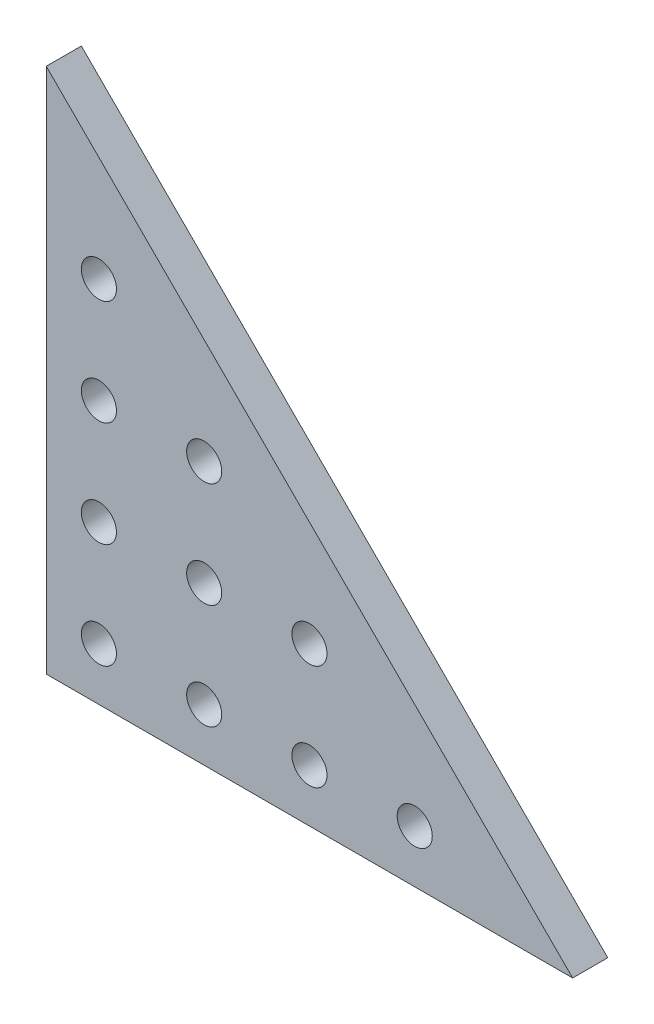
ISO-10303-21;
HEADER;
FILE_DESCRIPTION(('STEP AP214'),'2;1');
FILE_NAME('part.step','',(''),(''),'','','');
FILE_SCHEMA(('AUTOMOTIVE_DESIGN { 1 0 10303 214 1 1 1 1 }'));
ENDSEC;
DATA;
#1=APPLICATION_CONTEXT('core data for automotive mechanical design processes');
#2=APPLICATION_PROTOCOL_DEFINITION('international standard','automotive_design',2000,#1);
#3=PRODUCT_CONTEXT('',#1,'mechanical');
#4=PRODUCT('Part','Part','',(#3));
#5=PRODUCT_RELATED_PRODUCT_CATEGORY('part','',(#4));
#6=PRODUCT_DEFINITION_FORMATION('','',#4);
#7=PRODUCT_DEFINITION_CONTEXT('part definition',#1,'design');
#8=PRODUCT_DEFINITION('design','',#6,#7);
#9=PRODUCT_DEFINITION_SHAPE('','',#8);
#10=(LENGTH_UNIT() NAMED_UNIT(*) SI_UNIT(.MILLI.,.METRE.));
#11=(NAMED_UNIT(*) PLANE_ANGLE_UNIT() SI_UNIT($,.RADIAN.));
#12=(NAMED_UNIT(*) SI_UNIT($,.STERADIAN.) SOLID_ANGLE_UNIT());
#13=UNCERTAINTY_MEASURE_WITH_UNIT(LENGTH_MEASURE(1.E-05),#10,'distance_accuracy_value','');
#14=(GEOMETRIC_REPRESENTATION_CONTEXT(3) GLOBAL_UNCERTAINTY_ASSIGNED_CONTEXT((#13)) GLOBAL_UNIT_ASSIGNED_CONTEXT((#10,
#11,#12)) REPRESENTATION_CONTEXT('',''));
#15=CARTESIAN_POINT('',(0.,0.,0.));
#16=DIRECTION('',(0.,0.,1.));
#17=DIRECTION('',(1.,0.,0.));
#18=AXIS2_PLACEMENT_3D('',#15,#16,#17);
#19=CARTESIAN_POINT('',(0.,0.,3.));
#20=DIRECTION('',(0.,0.,1.));
#21=DIRECTION('',(1.,0.,0.));
#22=AXIS2_PLACEMENT_3D('',#19,#20,#21);
#23=PLANE('',#22);
#24=CARTESIAN_POINT('',(-83.443383637,65.056539338,3.));
#25=DIRECTION('',(0.,0.,1.));
#26=DIRECTION('',(1.,0.,0.));
#27=AXIS2_PLACEMENT_3D('',#24,#25,#26);
#28=CIRCLE('',#27,1.5);
#29=CARTESIAN_POINT('',(-81.943383637,65.056539338,3.));
#30=VERTEX_POINT('',#29);
#31=EDGE_CURVE('E125',#30,#30,#28,.T.);
#32=ORIENTED_EDGE('',*,*,#31,.F.);
#33=EDGE_LOOP('',(#32));
#34=FACE_BOUND('',#33,.T.);
#35=CARTESIAN_POINT('',(-101.443383637,65.056539338,3.));
#36=DIRECTION('',(0.,0.,1.));
#37=DIRECTION('',(1.,0.,0.));
#38=AXIS2_PLACEMENT_3D('',#35,#36,#37);
#39=CIRCLE('',#38,1.5);
#40=CARTESIAN_POINT('',(-99.943383637,65.056539338,3.));
#41=VERTEX_POINT('',#40);
#42=EDGE_CURVE('E135',#41,#41,#39,.T.);
#43=ORIENTED_EDGE('',*,*,#42,.F.);
#44=EDGE_LOOP('',(#43));
#45=FACE_BOUND('',#44,.T.);
#46=CARTESIAN_POINT('',(-92.443383637,74.056539338,3.));
#47=DIRECTION('',(0.,0.,1.));
#48=DIRECTION('',(1.,0.,0.));
#49=AXIS2_PLACEMENT_3D('',#46,#47,#48);
#50=CIRCLE('',#49,1.5);
#51=CARTESIAN_POINT('',(-90.943383637,74.056539338,3.));
#52=VERTEX_POINT('',#51);
#53=EDGE_CURVE('E145',#52,#52,#50,.T.);
#54=ORIENTED_EDGE('',*,*,#53,.F.);
#55=EDGE_LOOP('',(#54));
#56=FACE_BOUND('',#55,.T.);
#57=CARTESIAN_POINT('',(-92.443383637,83.056539338,3.));
#58=DIRECTION('',(0.,0.,1.));
#59=DIRECTION('',(1.,0.,0.));
#60=AXIS2_PLACEMENT_3D('',#57,#58,#59);
#61=CIRCLE('',#60,1.5);
#62=CARTESIAN_POINT('',(-90.943383637,83.056539338,3.));
#63=VERTEX_POINT('',#62);
#64=EDGE_CURVE('E155',#63,#63,#61,.T.);
#65=ORIENTED_EDGE('',*,*,#64,.F.);
#66=EDGE_LOOP('',(#65));
#67=FACE_BOUND('',#66,.T.);
#68=CARTESIAN_POINT('',(-101.443383637,92.056539338,3.));
#69=DIRECTION('',(0.,0.,1.));
#70=DIRECTION('',(1.,0.,0.));
#71=AXIS2_PLACEMENT_3D('',#68,#69,#70);
#72=CIRCLE('',#71,1.5);
#73=CARTESIAN_POINT('',(-99.943383637,92.056539338,3.));
#74=VERTEX_POINT('',#73);
#75=EDGE_CURVE('E84',#74,#74,#72,.T.);
#76=ORIENTED_EDGE('',*,*,#75,.F.);
#77=EDGE_LOOP('',(#76));
#78=FACE_BOUND('',#77,.T.);
#79=DIRECTION('',(-0.707106781186548,0.707106781186547,0.));
#80=VECTOR('',#79,1.);
#81=CARTESIAN_POINT('',(-105.943383637,105.556539338,3.));
#82=LINE('',#81,#80);
#83=CARTESIAN_POINT('',(-60.943383637,60.556539338,3.));
#84=VERTEX_POINT('',#83);
#85=CARTESIAN_POINT('',(-105.943383637,105.556539338,3.));
#86=VERTEX_POINT('',#85);
#87=EDGE_CURVE('E74',#84,#86,#82,.T.);
#88=ORIENTED_EDGE('',*,*,#87,.T.);
#89=DIRECTION('',(0.,-1.,0.));
#90=VECTOR('',#89,1.);
#91=CARTESIAN_POINT('',(-105.943383637,105.556539338,3.));
#92=LINE('',#91,#90);
#93=CARTESIAN_POINT('',(-105.943383637,60.556539338,3.));
#94=VERTEX_POINT('',#93);
#95=EDGE_CURVE('E70',#86,#94,#92,.T.);
#96=ORIENTED_EDGE('',*,*,#95,.T.);
#97=DIRECTION('',(1.,0.,0.));
#98=VECTOR('',#97,1.);
#99=CARTESIAN_POINT('',(-105.943383637,60.556539338,3.));
#100=LINE('',#99,#98);
#101=EDGE_CURVE('E50',#94,#84,#100,.T.);
#102=ORIENTED_EDGE('',*,*,#101,.T.);
#103=EDGE_LOOP('',(#88,#96,#102));
#104=FACE_BOUND('',#103,.T.);
#105=CARTESIAN_POINT('',(-101.443383637,83.056539338,3.));
#106=DIRECTION('',(0.,0.,1.));
#107=DIRECTION('',(1.,0.,0.));
#108=AXIS2_PLACEMENT_3D('',#105,#106,#107);
#109=CIRCLE('',#108,1.5);
#110=CARTESIAN_POINT('',(-99.943383637,83.056539338,3.));
#111=VERTEX_POINT('',#110);
#112=EDGE_CURVE('E160',#111,#111,#109,.T.);
#113=ORIENTED_EDGE('',*,*,#112,.F.);
#114=EDGE_LOOP('',(#113));
#115=FACE_BOUND('',#114,.T.);
#116=CARTESIAN_POINT('',(-101.443383637,74.056539338,3.));
#117=DIRECTION('',(0.,0.,1.));
#118=DIRECTION('',(1.,0.,0.));
#119=AXIS2_PLACEMENT_3D('',#116,#117,#118);
#120=CIRCLE('',#119,1.5);
#121=CARTESIAN_POINT('',(-99.943383637,74.056539338,3.));
#122=VERTEX_POINT('',#121);
#123=EDGE_CURVE('E150',#122,#122,#120,.T.);
#124=ORIENTED_EDGE('',*,*,#123,.F.);
#125=EDGE_LOOP('',(#124));
#126=FACE_BOUND('',#125,.T.);
#127=CARTESIAN_POINT('',(-83.443383637,74.056539338,3.));
#128=DIRECTION('',(0.,0.,1.));
#129=DIRECTION('',(1.,0.,0.));
#130=AXIS2_PLACEMENT_3D('',#127,#128,#129);
#131=CIRCLE('',#130,1.5);
#132=CARTESIAN_POINT('',(-81.943383637,74.056539338,3.));
#133=VERTEX_POINT('',#132);
#134=EDGE_CURVE('E140',#133,#133,#131,.T.);
#135=ORIENTED_EDGE('',*,*,#134,.F.);
#136=EDGE_LOOP('',(#135));
#137=FACE_BOUND('',#136,.T.);
#138=CARTESIAN_POINT('',(-92.443383637,65.056539338,3.));
#139=DIRECTION('',(0.,0.,1.));
#140=DIRECTION('',(1.,0.,0.));
#141=AXIS2_PLACEMENT_3D('',#138,#139,#140);
#142=CIRCLE('',#141,1.5);
#143=CARTESIAN_POINT('',(-90.943383637,65.056539338,3.));
#144=VERTEX_POINT('',#143);
#145=EDGE_CURVE('E130',#144,#144,#142,.T.);
#146=ORIENTED_EDGE('',*,*,#145,.F.);
#147=EDGE_LOOP('',(#146));
#148=FACE_BOUND('',#147,.T.);
#149=CARTESIAN_POINT('',(-74.443383637,65.056539338,3.));
#150=DIRECTION('',(0.,0.,1.));
#151=DIRECTION('',(1.,0.,0.));
#152=AXIS2_PLACEMENT_3D('',#149,#150,#151);
#153=CIRCLE('',#152,1.5);
#154=CARTESIAN_POINT('',(-72.943383637,65.056539338,3.));
#155=VERTEX_POINT('',#154);
#156=EDGE_CURVE('E119',#155,#155,#153,.T.);
#157=ORIENTED_EDGE('',*,*,#156,.F.);
#158=EDGE_LOOP('',(#157));
#159=FACE_BOUND('',#158,.T.);
#160=ADVANCED_FACE('F33',(#34,#45,#56,#67,#78,#104,#115,#126,#137,#148,#159),#23,.T.);
#161=CARTESIAN_POINT('',(0.,0.,0.));
#162=DIRECTION('',(0.,0.,1.));
#163=DIRECTION('',(1.,0.,0.));
#164=AXIS2_PLACEMENT_3D('',#161,#162,#163);
#165=PLANE('',#164);
#166=CARTESIAN_POINT('',(-83.443383637,65.056539338,0.));
#167=DIRECTION('',(0.,0.,1.));
#168=DIRECTION('',(1.,0.,0.));
#169=AXIS2_PLACEMENT_3D('',#166,#167,#168);
#170=CIRCLE('',#169,1.5);
#171=CARTESIAN_POINT('',(-81.943383637,65.056539338,0.));
#172=VERTEX_POINT('',#171);
#173=EDGE_CURVE('E122',#172,#172,#170,.T.);
#174=ORIENTED_EDGE('',*,*,#173,.T.);
#175=EDGE_LOOP('',(#174));
#176=FACE_BOUND('',#175,.T.);
#177=CARTESIAN_POINT('',(-101.443383637,65.056539338,0.));
#178=DIRECTION('',(0.,0.,1.));
#179=DIRECTION('',(1.,0.,0.));
#180=AXIS2_PLACEMENT_3D('',#177,#178,#179);
#181=CIRCLE('',#180,1.5);
#182=CARTESIAN_POINT('',(-99.943383637,65.056539338,0.));
#183=VERTEX_POINT('',#182);
#184=EDGE_CURVE('E133',#183,#183,#181,.T.);
#185=ORIENTED_EDGE('',*,*,#184,.T.);
#186=EDGE_LOOP('',(#185));
#187=FACE_BOUND('',#186,.T.);
#188=CARTESIAN_POINT('',(-92.443383637,74.056539338,0.));
#189=DIRECTION('',(0.,0.,1.));
#190=DIRECTION('',(1.,0.,0.));
#191=AXIS2_PLACEMENT_3D('',#188,#189,#190);
#192=CIRCLE('',#191,1.5);
#193=CARTESIAN_POINT('',(-90.943383637,74.056539338,0.));
#194=VERTEX_POINT('',#193);
#195=EDGE_CURVE('E143',#194,#194,#192,.T.);
#196=ORIENTED_EDGE('',*,*,#195,.T.);
#197=EDGE_LOOP('',(#196));
#198=FACE_BOUND('',#197,.T.);
#199=CARTESIAN_POINT('',(-92.443383637,83.056539338,0.));
#200=DIRECTION('',(0.,0.,1.));
#201=DIRECTION('',(1.,0.,0.));
#202=AXIS2_PLACEMENT_3D('',#199,#200,#201);
#203=CIRCLE('',#202,1.5);
#204=CARTESIAN_POINT('',(-90.943383637,83.056539338,0.));
#205=VERTEX_POINT('',#204);
#206=EDGE_CURVE('E153',#205,#205,#203,.T.);
#207=ORIENTED_EDGE('',*,*,#206,.T.);
#208=EDGE_LOOP('',(#207));
#209=FACE_BOUND('',#208,.T.);
#210=CARTESIAN_POINT('',(-101.443383637,92.056539338,0.));
#211=DIRECTION('',(0.,0.,1.));
#212=DIRECTION('',(1.,0.,0.));
#213=AXIS2_PLACEMENT_3D('',#210,#211,#212);
#214=CIRCLE('',#213,1.5);
#215=CARTESIAN_POINT('',(-99.943383637,92.056539338,0.));
#216=VERTEX_POINT('',#215);
#217=EDGE_CURVE('E88',#216,#216,#214,.T.);
#218=ORIENTED_EDGE('',*,*,#217,.T.);
#219=EDGE_LOOP('',(#218));
#220=FACE_BOUND('',#219,.T.);
#221=DIRECTION('',(-0.707106781186548,0.707106781186547,0.));
#222=VECTOR('',#221,1.);
#223=CARTESIAN_POINT('',(-105.943383637,105.556539338,0.));
#224=LINE('',#223,#222);
#225=CARTESIAN_POINT('',(-60.943383637,60.556539338,0.));
#226=VERTEX_POINT('',#225);
#227=CARTESIAN_POINT('',(-105.943383637,105.556539338,0.));
#228=VERTEX_POINT('',#227);
#229=EDGE_CURVE('E81',#226,#228,#224,.T.);
#230=ORIENTED_EDGE('',*,*,#229,.F.);
#231=DIRECTION('',(1.,0.,0.));
#232=VECTOR('',#231,1.);
#233=CARTESIAN_POINT('',(-105.943383637,60.556539338,0.));
#234=LINE('',#233,#232);
#235=CARTESIAN_POINT('',(-105.943383637,60.556539338,0.));
#236=VERTEX_POINT('',#235);
#237=EDGE_CURVE('E67',#236,#226,#234,.T.);
#238=ORIENTED_EDGE('',*,*,#237,.F.);
#239=DIRECTION('',(0.,-1.,0.));
#240=VECTOR('',#239,1.);
#241=CARTESIAN_POINT('',(-105.943383637,105.556539338,0.));
#242=LINE('',#241,#240);
#243=EDGE_CURVE('E62',#228,#236,#242,.T.);
#244=ORIENTED_EDGE('',*,*,#243,.F.);
#245=EDGE_LOOP('',(#230,#238,#244));
#246=FACE_BOUND('',#245,.T.);
#247=CARTESIAN_POINT('',(-101.443383637,83.056539338,0.));
#248=DIRECTION('',(0.,0.,1.));
#249=DIRECTION('',(1.,0.,0.));
#250=AXIS2_PLACEMENT_3D('',#247,#248,#249);
#251=CIRCLE('',#250,1.5);
#252=CARTESIAN_POINT('',(-99.943383637,83.056539338,0.));
#253=VERTEX_POINT('',#252);
#254=EDGE_CURVE('E102',#253,#253,#251,.T.);
#255=ORIENTED_EDGE('',*,*,#254,.T.);
#256=EDGE_LOOP('',(#255));
#257=FACE_BOUND('',#256,.T.);
#258=CARTESIAN_POINT('',(-101.443383637,74.056539338,0.));
#259=DIRECTION('',(0.,0.,1.));
#260=DIRECTION('',(1.,0.,0.));
#261=AXIS2_PLACEMENT_3D('',#258,#259,#260);
#262=CIRCLE('',#261,1.5);
#263=CARTESIAN_POINT('',(-99.943383637,74.056539338,0.));
#264=VERTEX_POINT('',#263);
#265=EDGE_CURVE('E106',#264,#264,#262,.T.);
#266=ORIENTED_EDGE('',*,*,#265,.T.);
#267=EDGE_LOOP('',(#266));
#268=FACE_BOUND('',#267,.T.);
#269=CARTESIAN_POINT('',(-83.443383637,74.056539338,0.));
#270=DIRECTION('',(0.,0.,1.));
#271=DIRECTION('',(1.,0.,0.));
#272=AXIS2_PLACEMENT_3D('',#269,#270,#271);
#273=CIRCLE('',#272,1.5);
#274=CARTESIAN_POINT('',(-81.943383637,74.056539338,0.));
#275=VERTEX_POINT('',#274);
#276=EDGE_CURVE('E110',#275,#275,#273,.T.);
#277=ORIENTED_EDGE('',*,*,#276,.T.);
#278=EDGE_LOOP('',(#277));
#279=FACE_BOUND('',#278,.T.);
#280=CARTESIAN_POINT('',(-92.443383637,65.056539338,0.));
#281=DIRECTION('',(0.,0.,1.));
#282=DIRECTION('',(1.,0.,0.));
#283=AXIS2_PLACEMENT_3D('',#280,#281,#282);
#284=CIRCLE('',#283,1.5);
#285=CARTESIAN_POINT('',(-90.943383637,65.056539338,0.));
#286=VERTEX_POINT('',#285);
#287=EDGE_CURVE('E114',#286,#286,#284,.T.);
#288=ORIENTED_EDGE('',*,*,#287,.T.);
#289=EDGE_LOOP('',(#288));
#290=FACE_BOUND('',#289,.T.);
#291=CARTESIAN_POINT('',(-74.443383637,65.056539338,0.));
#292=DIRECTION('',(0.,0.,1.));
#293=DIRECTION('',(1.,0.,0.));
#294=AXIS2_PLACEMENT_3D('',#291,#292,#293);
#295=CIRCLE('',#294,1.5);
#296=CARTESIAN_POINT('',(-72.943383637,65.056539338,0.));
#297=VERTEX_POINT('',#296);
#298=EDGE_CURVE('E117',#297,#297,#295,.T.);
#299=ORIENTED_EDGE('',*,*,#298,.T.);
#300=EDGE_LOOP('',(#299));
#301=FACE_BOUND('',#300,.T.);
#302=ADVANCED_FACE('F94',(#176,#187,#198,#209,#220,#246,#257,#268,#279,#290,#301),#165,.F.);
#303=CARTESIAN_POINT('',(-105.943383637,105.556539338,3.));
#304=DIRECTION('',(-0.707106781186547,-0.707106781186548,0.));
#305=DIRECTION('',(0.707106781186548,-0.707106781186547,0.));
#306=AXIS2_PLACEMENT_3D('',#303,#304,#305);
#307=PLANE('',#306);
#308=ORIENTED_EDGE('',*,*,#229,.T.);
#309=DIRECTION('',(0.,0.,-1.));
#310=VECTOR('',#309,1.);
#311=CARTESIAN_POINT('',(-105.943383637,105.556539338,3.));
#312=LINE('',#311,#310);
#313=EDGE_CURVE('E11',#86,#228,#312,.T.);
#314=ORIENTED_EDGE('',*,*,#313,.F.);
#315=ORIENTED_EDGE('',*,*,#87,.F.);
#316=DIRECTION('',(0.,0.,-1.));
#317=VECTOR('',#316,1.);
#318=CARTESIAN_POINT('',(-60.943383637,60.556539338,3.));
#319=LINE('',#318,#317);
#320=EDGE_CURVE('E82',#84,#226,#319,.T.);
#321=ORIENTED_EDGE('',*,*,#320,.T.);
#322=EDGE_LOOP('',(#308,#314,#315,#321));
#323=FACE_BOUND('',#322,.T.);
#324=ADVANCED_FACE('F35',(#323),#307,.F.);
#325=CARTESIAN_POINT('',(-105.943383637,105.556539338,3.));
#326=DIRECTION('',(1.,0.,0.));
#327=DIRECTION('',(0.,0.,-1.));
#328=AXIS2_PLACEMENT_3D('',#325,#326,#327);
#329=PLANE('',#328);
#330=ORIENTED_EDGE('',*,*,#243,.T.);
#331=DIRECTION('',(0.,0.,-1.));
#332=VECTOR('',#331,1.);
#333=CARTESIAN_POINT('',(-105.943383637,60.556539338,3.));
#334=LINE('',#333,#332);
#335=EDGE_CURVE('E42',#94,#236,#334,.T.);
#336=ORIENTED_EDGE('',*,*,#335,.F.);
#337=ORIENTED_EDGE('',*,*,#95,.F.);
#338=ORIENTED_EDGE('',*,*,#313,.T.);
#339=EDGE_LOOP('',(#330,#336,#337,#338));
#340=FACE_BOUND('',#339,.T.);
#341=ADVANCED_FACE('F71',(#340),#329,.F.);
#342=CARTESIAN_POINT('',(-105.943383637,60.556539338,3.));
#343=DIRECTION('',(0.,1.,0.));
#344=DIRECTION('',(0.,0.,1.));
#345=AXIS2_PLACEMENT_3D('',#342,#343,#344);
#346=PLANE('',#345);
#347=ORIENTED_EDGE('',*,*,#237,.T.);
#348=ORIENTED_EDGE('',*,*,#320,.F.);
#349=ORIENTED_EDGE('',*,*,#101,.F.);
#350=ORIENTED_EDGE('',*,*,#335,.T.);
#351=EDGE_LOOP('',(#347,#348,#349,#350));
#352=FACE_BOUND('',#351,.T.);
#353=ADVANCED_FACE('F93',(#352),#346,.F.);
#354=CARTESIAN_POINT('',(-101.443383637,92.056539338,3.));
#355=DIRECTION('',(0.,0.,-1.));
#356=DIRECTION('',(-1.,0.,0.));
#357=AXIS2_PLACEMENT_3D('',#354,#355,#356);
#358=CYLINDRICAL_SURFACE('',#357,1.5);
#359=ORIENTED_EDGE('',*,*,#75,.T.);
#360=EDGE_LOOP('',(#359));
#361=FACE_BOUND('',#360,.T.);
#362=ORIENTED_EDGE('',*,*,#217,.F.);
#363=EDGE_LOOP('',(#362));
#364=FACE_BOUND('',#363,.T.);
#365=ADVANCED_FACE('F168',(#361,#364),#358,.F.);
#366=CARTESIAN_POINT('',(-101.443383637,83.056539338,3.));
#367=DIRECTION('',(0.,0.,-1.));
#368=DIRECTION('',(-1.,0.,0.));
#369=AXIS2_PLACEMENT_3D('',#366,#367,#368);
#370=CYLINDRICAL_SURFACE('',#369,1.5);
#371=ORIENTED_EDGE('',*,*,#112,.T.);
#372=EDGE_LOOP('',(#371));
#373=FACE_BOUND('',#372,.T.);
#374=ORIENTED_EDGE('',*,*,#254,.F.);
#375=EDGE_LOOP('',(#374));
#376=FACE_BOUND('',#375,.T.);
#377=ADVANCED_FACE('F170',(#373,#376),#370,.F.);
#378=CARTESIAN_POINT('',(-92.443383637,83.056539338,3.));
#379=DIRECTION('',(0.,0.,-1.));
#380=DIRECTION('',(-1.,0.,0.));
#381=AXIS2_PLACEMENT_3D('',#378,#379,#380);
#382=CYLINDRICAL_SURFACE('',#381,1.5);
#383=ORIENTED_EDGE('',*,*,#64,.T.);
#384=EDGE_LOOP('',(#383));
#385=FACE_BOUND('',#384,.T.);
#386=ORIENTED_EDGE('',*,*,#206,.F.);
#387=EDGE_LOOP('',(#386));
#388=FACE_BOUND('',#387,.T.);
#389=ADVANCED_FACE('F177',(#385,#388),#382,.F.);
#390=CARTESIAN_POINT('',(-101.443383637,74.056539338,3.));
#391=DIRECTION('',(0.,0.,-1.));
#392=DIRECTION('',(-1.,0.,0.));
#393=AXIS2_PLACEMENT_3D('',#390,#391,#392);
#394=CYLINDRICAL_SURFACE('',#393,1.5);
#395=ORIENTED_EDGE('',*,*,#123,.T.);
#396=EDGE_LOOP('',(#395));
#397=FACE_BOUND('',#396,.T.);
#398=ORIENTED_EDGE('',*,*,#265,.F.);
#399=EDGE_LOOP('',(#398));
#400=FACE_BOUND('',#399,.T.);
#401=ADVANCED_FACE('F232',(#397,#400),#394,.F.);
#402=CARTESIAN_POINT('',(-92.443383637,74.056539338,3.));
#403=DIRECTION('',(0.,0.,-1.));
#404=DIRECTION('',(-1.,0.,0.));
#405=AXIS2_PLACEMENT_3D('',#402,#403,#404);
#406=CYLINDRICAL_SURFACE('',#405,1.5);
#407=ORIENTED_EDGE('',*,*,#53,.T.);
#408=EDGE_LOOP('',(#407));
#409=FACE_BOUND('',#408,.T.);
#410=ORIENTED_EDGE('',*,*,#195,.F.);
#411=EDGE_LOOP('',(#410));
#412=FACE_BOUND('',#411,.T.);
#413=ADVANCED_FACE('F241',(#409,#412),#406,.F.);
#414=CARTESIAN_POINT('',(-83.443383637,74.056539338,3.));
#415=DIRECTION('',(0.,0.,-1.));
#416=DIRECTION('',(-1.,0.,0.));
#417=AXIS2_PLACEMENT_3D('',#414,#415,#416);
#418=CYLINDRICAL_SURFACE('',#417,1.5);
#419=ORIENTED_EDGE('',*,*,#134,.T.);
#420=EDGE_LOOP('',(#419));
#421=FACE_BOUND('',#420,.T.);
#422=ORIENTED_EDGE('',*,*,#276,.F.);
#423=EDGE_LOOP('',(#422));
#424=FACE_BOUND('',#423,.T.);
#425=ADVANCED_FACE('F250',(#421,#424),#418,.F.);
#426=CARTESIAN_POINT('',(-101.443383637,65.056539338,3.));
#427=DIRECTION('',(0.,0.,-1.));
#428=DIRECTION('',(-1.,0.,0.));
#429=AXIS2_PLACEMENT_3D('',#426,#427,#428);
#430=CYLINDRICAL_SURFACE('',#429,1.5);
#431=ORIENTED_EDGE('',*,*,#42,.T.);
#432=EDGE_LOOP('',(#431));
#433=FACE_BOUND('',#432,.T.);
#434=ORIENTED_EDGE('',*,*,#184,.F.);
#435=EDGE_LOOP('',(#434));
#436=FACE_BOUND('',#435,.T.);
#437=ADVANCED_FACE('F259',(#433,#436),#430,.F.);
#438=CARTESIAN_POINT('',(-92.443383637,65.056539338,3.));
#439=DIRECTION('',(0.,0.,-1.));
#440=DIRECTION('',(-1.,0.,0.));
#441=AXIS2_PLACEMENT_3D('',#438,#439,#440);
#442=CYLINDRICAL_SURFACE('',#441,1.5);
#443=ORIENTED_EDGE('',*,*,#145,.T.);
#444=EDGE_LOOP('',(#443));
#445=FACE_BOUND('',#444,.T.);
#446=ORIENTED_EDGE('',*,*,#287,.F.);
#447=EDGE_LOOP('',(#446));
#448=FACE_BOUND('',#447,.T.);
#449=ADVANCED_FACE('F268',(#445,#448),#442,.F.);
#450=CARTESIAN_POINT('',(-83.443383637,65.056539338,3.));
#451=DIRECTION('',(0.,0.,-1.));
#452=DIRECTION('',(-1.,0.,0.));
#453=AXIS2_PLACEMENT_3D('',#450,#451,#452);
#454=CYLINDRICAL_SURFACE('',#453,1.5);
#455=ORIENTED_EDGE('',*,*,#31,.T.);
#456=EDGE_LOOP('',(#455));
#457=FACE_BOUND('',#456,.T.);
#458=ORIENTED_EDGE('',*,*,#173,.F.);
#459=EDGE_LOOP('',(#458));
#460=FACE_BOUND('',#459,.T.);
#461=ADVANCED_FACE('F277',(#457,#460),#454,.F.);
#462=CARTESIAN_POINT('',(-74.443383637,65.056539338,3.));
#463=DIRECTION('',(0.,0.,-1.));
#464=DIRECTION('',(-1.,0.,0.));
#465=AXIS2_PLACEMENT_3D('',#462,#463,#464);
#466=CYLINDRICAL_SURFACE('',#465,1.5);
#467=ORIENTED_EDGE('',*,*,#156,.T.);
#468=EDGE_LOOP('',(#467));
#469=FACE_BOUND('',#468,.T.);
#470=ORIENTED_EDGE('',*,*,#298,.F.);
#471=EDGE_LOOP('',(#470));
#472=FACE_BOUND('',#471,.T.);
#473=ADVANCED_FACE('F286',(#469,#472),#466,.F.);
#474=CLOSED_SHELL('',(#160,#302,#324,#341,#353,#365,#377,#389,#401,#413,#425,#437,#449,#461,#473));
#475=MANIFOLD_SOLID_BREP('B2',#474);
#476=ADVANCED_BREP_SHAPE_REPRESENTATION('',(#18,#475),#14);
#477=SHAPE_DEFINITION_REPRESENTATION(#9,#476);
ENDSEC;
END-ISO-10303-21;
